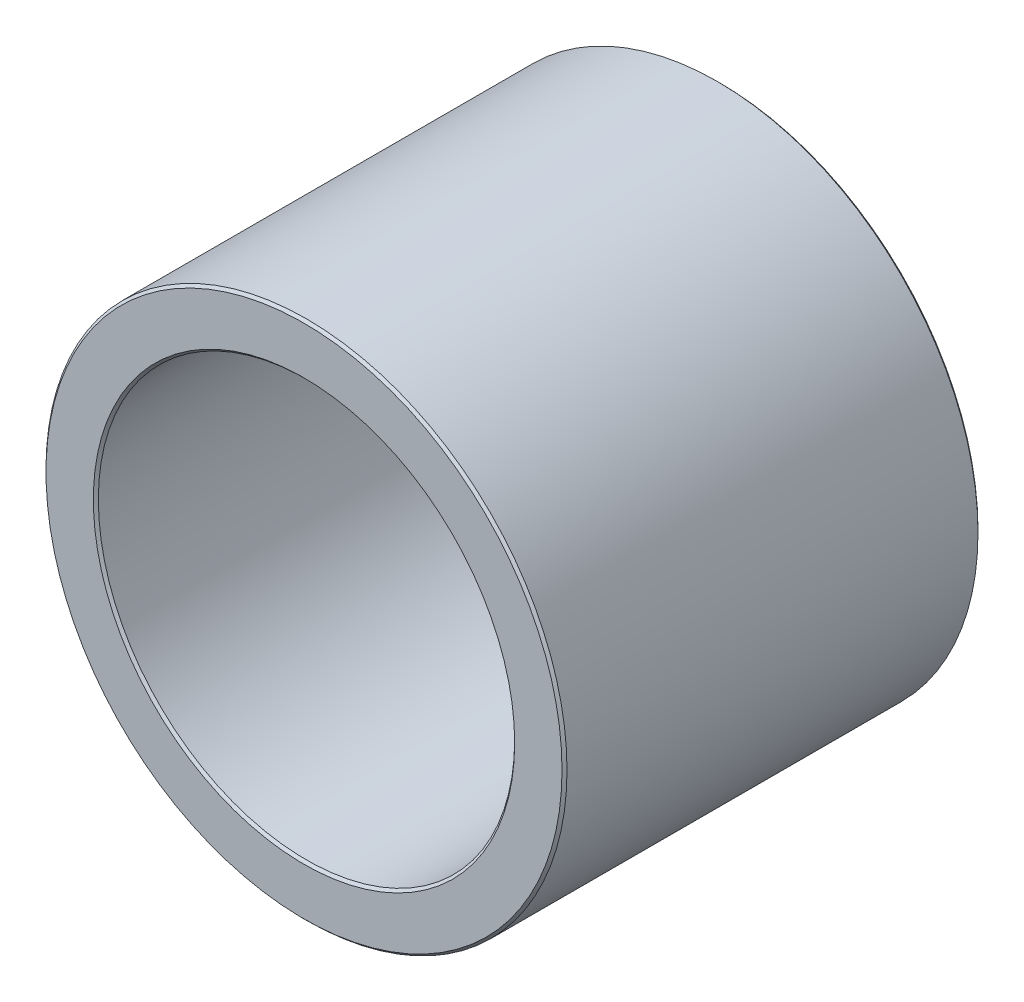
ISO-10303-21;
HEADER;
FILE_DESCRIPTION(('STEP AP214'),'2;1');
FILE_NAME('part.step','',(''),(''),'','','');
FILE_SCHEMA(('AUTOMOTIVE_DESIGN { 1 0 10303 214 1 1 1 1 }'));
ENDSEC;
DATA;
#1=APPLICATION_CONTEXT('core data for automotive mechanical design processes');
#2=APPLICATION_PROTOCOL_DEFINITION('international standard','automotive_design',2000,#1);
#3=PRODUCT_CONTEXT('',#1,'mechanical');
#4=PRODUCT('Part','Part','',(#3));
#5=PRODUCT_RELATED_PRODUCT_CATEGORY('part','',(#4));
#6=PRODUCT_DEFINITION_FORMATION('','',#4);
#7=PRODUCT_DEFINITION_CONTEXT('part definition',#1,'design');
#8=PRODUCT_DEFINITION('design','',#6,#7);
#9=PRODUCT_DEFINITION_SHAPE('','',#8);
#10=(LENGTH_UNIT() NAMED_UNIT(*) SI_UNIT(.MILLI.,.METRE.));
#11=(NAMED_UNIT(*) PLANE_ANGLE_UNIT() SI_UNIT($,.RADIAN.));
#12=(NAMED_UNIT(*) SI_UNIT($,.STERADIAN.) SOLID_ANGLE_UNIT());
#13=UNCERTAINTY_MEASURE_WITH_UNIT(LENGTH_MEASURE(1.E-05),#10,'distance_accuracy_value','');
#14=(GEOMETRIC_REPRESENTATION_CONTEXT(3) GLOBAL_UNCERTAINTY_ASSIGNED_CONTEXT((#13)) GLOBAL_UNIT_ASSIGNED_CONTEXT((#10,
#11,#12)) REPRESENTATION_CONTEXT('',''));
#15=CARTESIAN_POINT('',(0.,0.,0.));
#16=DIRECTION('',(0.,0.,1.));
#17=DIRECTION('',(1.,0.,0.));
#18=AXIS2_PLACEMENT_3D('',#15,#16,#17);
#19=CARTESIAN_POINT('',(0.,0.,6.));
#20=DIRECTION('',(0.,0.,1.));
#21=DIRECTION('',(1.,0.,0.));
#22=AXIS2_PLACEMENT_3D('',#19,#20,#21);
#23=PLANE('',#22);
#24=CARTESIAN_POINT('',(0.,0.,6.));
#25=DIRECTION('',(0.,0.,1.));
#26=DIRECTION('',(1.,0.,0.));
#27=AXIS2_PLACEMENT_3D('',#24,#25,#26);
#28=CIRCLE('',#27,6.07706000000001);
#29=CARTESIAN_POINT('',(6.07706000000001,0.,6.));
#30=VERTEX_POINT('',#29);
#31=EDGE_CURVE('E10',#30,#30,#28,.F.);
#32=ORIENTED_EDGE('',*,*,#31,.T.);
#33=EDGE_LOOP('',(#32));
#34=FACE_BOUND('',#33,.T.);
#35=CARTESIAN_POINT('',(0.,0.,6.));
#36=DIRECTION('',(0.,0.,1.));
#37=DIRECTION('',(1.,0.,0.));
#38=AXIS2_PLACEMENT_3D('',#35,#36,#37);
#39=CIRCLE('',#38,7.44294);
#40=CARTESIAN_POINT('',(7.44294,0.,6.));
#41=VERTEX_POINT('',#40);
#42=EDGE_CURVE('E39',#41,#41,#39,.T.);
#43=ORIENTED_EDGE('',*,*,#42,.T.);
#44=EDGE_LOOP('',(#43));
#45=FACE_BOUND('',#44,.T.);
#46=ADVANCED_FACE('F32',(#34,#45),#23,.T.);
#47=CARTESIAN_POINT('',(0.,0.,6.));
#48=DIRECTION('',(0.,0.,-1.));
#49=DIRECTION('',(-1.,0.,0.));
#50=AXIS2_PLACEMENT_3D('',#47,#48,#49);
#51=CYLINDRICAL_SURFACE('',#50,7.515);
#52=CARTESIAN_POINT('',(0.,0.,-5.92793999999999));
#53=DIRECTION('',(0.,0.,1.));
#54=DIRECTION('',(1.,0.,0.));
#55=AXIS2_PLACEMENT_3D('',#52,#53,#54);
#56=CIRCLE('',#55,7.515);
#57=CARTESIAN_POINT('',(7.515,0.,-5.92793999999999));
#58=VERTEX_POINT('',#57);
#59=EDGE_CURVE('E58',#58,#58,#56,.T.);
#60=ORIENTED_EDGE('',*,*,#59,.T.);
#61=EDGE_LOOP('',(#60));
#62=FACE_BOUND('',#61,.T.);
#63=CARTESIAN_POINT('',(0.,0.,5.92793999999999));
#64=DIRECTION('',(0.,0.,1.));
#65=DIRECTION('',(1.,0.,0.));
#66=AXIS2_PLACEMENT_3D('',#63,#64,#65);
#67=CIRCLE('',#66,7.515);
#68=CARTESIAN_POINT('',(7.515,0.,5.92793999999999));
#69=VERTEX_POINT('',#68);
#70=EDGE_CURVE('E61',#69,#69,#67,.F.);
#71=ORIENTED_EDGE('',*,*,#70,.T.);
#72=EDGE_LOOP('',(#71));
#73=FACE_BOUND('',#72,.T.);
#74=ADVANCED_FACE('F65',(#62,#73),#51,.T.);
#75=CARTESIAN_POINT('',(0.,0.,6.));
#76=DIRECTION('',(0.,0.,-1.));
#77=DIRECTION('',(-1.,0.,0.));
#78=AXIS2_PLACEMENT_3D('',#75,#76,#77);
#79=CYLINDRICAL_SURFACE('',#78,6.005);
#80=CARTESIAN_POINT('',(0.,0.,-5.92793999999999));
#81=DIRECTION('',(0.,0.,1.));
#82=DIRECTION('',(1.,0.,0.));
#83=AXIS2_PLACEMENT_3D('',#80,#81,#82);
#84=CIRCLE('',#83,6.005);
#85=CARTESIAN_POINT('',(6.005,0.,-5.92793999999999));
#86=VERTEX_POINT('',#85);
#87=EDGE_CURVE('E43',#86,#86,#84,.F.);
#88=ORIENTED_EDGE('',*,*,#87,.T.);
#89=EDGE_LOOP('',(#88));
#90=FACE_BOUND('',#89,.T.);
#91=CARTESIAN_POINT('',(0.,0.,5.92793999999999));
#92=DIRECTION('',(0.,0.,1.));
#93=DIRECTION('',(1.,0.,0.));
#94=AXIS2_PLACEMENT_3D('',#91,#92,#93);
#95=CIRCLE('',#94,6.005);
#96=CARTESIAN_POINT('',(6.005,0.,5.92793999999999));
#97=VERTEX_POINT('',#96);
#98=EDGE_CURVE('E47',#97,#97,#95,.T.);
#99=ORIENTED_EDGE('',*,*,#98,.T.);
#100=EDGE_LOOP('',(#99));
#101=FACE_BOUND('',#100,.T.);
#102=ADVANCED_FACE('F80',(#90,#101),#79,.F.);
#103=CARTESIAN_POINT('',(0.,0.,-6.));
#104=DIRECTION('',(0.,0.,1.));
#105=DIRECTION('',(1.,0.,0.));
#106=AXIS2_PLACEMENT_3D('',#103,#104,#105);
#107=PLANE('',#106);
#108=CARTESIAN_POINT('',(0.,0.,-6.));
#109=DIRECTION('',(0.,0.,1.));
#110=DIRECTION('',(1.,0.,0.));
#111=AXIS2_PLACEMENT_3D('',#108,#109,#110);
#112=CIRCLE('',#111,7.44294);
#113=CARTESIAN_POINT('',(7.44294,0.,-6.));
#114=VERTEX_POINT('',#113);
#115=EDGE_CURVE('E52',#114,#114,#112,.F.);
#116=ORIENTED_EDGE('',*,*,#115,.T.);
#117=EDGE_LOOP('',(#116));
#118=FACE_BOUND('',#117,.T.);
#119=CARTESIAN_POINT('',(0.,0.,-6.));
#120=DIRECTION('',(0.,0.,1.));
#121=DIRECTION('',(1.,0.,0.));
#122=AXIS2_PLACEMENT_3D('',#119,#120,#121);
#123=CIRCLE('',#122,6.07706000000001);
#124=CARTESIAN_POINT('',(6.07706000000001,0.,-6.));
#125=VERTEX_POINT('',#124);
#126=EDGE_CURVE('E55',#125,#125,#123,.T.);
#127=ORIENTED_EDGE('',*,*,#126,.T.);
#128=EDGE_LOOP('',(#127));
#129=FACE_BOUND('',#128,.T.);
#130=ADVANCED_FACE('F89',(#118,#129),#107,.F.);
#131=CARTESIAN_POINT('',(0.,0.,-5.92793999999999));
#132=DIRECTION('',(0.,0.,1.));
#133=DIRECTION('',(1.,0.,0.));
#134=AXIS2_PLACEMENT_3D('',#131,#132,#133);
#135=CONICAL_SURFACE('',#134,7.515,0.785398163397436);
#136=ORIENTED_EDGE('',*,*,#115,.F.);
#137=EDGE_LOOP('',(#136));
#138=FACE_BOUND('',#137,.T.);
#139=ORIENTED_EDGE('',*,*,#59,.F.);
#140=EDGE_LOOP('',(#139));
#141=FACE_BOUND('',#140,.T.);
#142=ADVANCED_FACE('F86',(#138,#141),#135,.T.);
#143=CARTESIAN_POINT('',(0.,0.,-6.));
#144=DIRECTION('',(0.,0.,-1.));
#145=DIRECTION('',(-1.,0.,0.));
#146=AXIS2_PLACEMENT_3D('',#143,#144,#145);
#147=CONICAL_SURFACE('',#146,6.07706000000001,0.785398163397454);
#148=ORIENTED_EDGE('',*,*,#87,.F.);
#149=EDGE_LOOP('',(#148));
#150=FACE_BOUND('',#149,.T.);
#151=ORIENTED_EDGE('',*,*,#126,.F.);
#152=EDGE_LOOP('',(#151));
#153=FACE_BOUND('',#152,.T.);
#154=ADVANCED_FACE('F73',(#150,#153),#147,.F.);
#155=CARTESIAN_POINT('',(0.,0.,5.92793999999999));
#156=DIRECTION('',(0.,0.,1.));
#157=DIRECTION('',(1.,0.,0.));
#158=AXIS2_PLACEMENT_3D('',#155,#156,#157);
#159=CONICAL_SURFACE('',#158,6.005,0.785398163397448);
#160=ORIENTED_EDGE('',*,*,#31,.F.);
#161=EDGE_LOOP('',(#160));
#162=FACE_BOUND('',#161,.T.);
#163=ORIENTED_EDGE('',*,*,#98,.F.);
#164=EDGE_LOOP('',(#163));
#165=FACE_BOUND('',#164,.T.);
#166=ADVANCED_FACE('F69',(#162,#165),#159,.F.);
#167=CARTESIAN_POINT('',(0.,0.,6.));
#168=DIRECTION('',(0.,0.,-1.));
#169=DIRECTION('',(-1.,0.,0.));
#170=AXIS2_PLACEMENT_3D('',#167,#168,#169);
#171=CONICAL_SURFACE('',#170,7.44294,0.785398163397424);
#172=ORIENTED_EDGE('',*,*,#70,.F.);
#173=EDGE_LOOP('',(#172));
#174=FACE_BOUND('',#173,.T.);
#175=ORIENTED_EDGE('',*,*,#42,.F.);
#176=EDGE_LOOP('',(#175));
#177=FACE_BOUND('',#176,.T.);
#178=ADVANCED_FACE('F34',(#174,#177),#171,.T.);
#179=CLOSED_SHELL('',(#46,#74,#102,#130,#142,#154,#166,#178));
#180=MANIFOLD_SOLID_BREP('B2',#179);
#181=ADVANCED_BREP_SHAPE_REPRESENTATION('',(#18,#180),#14);
#182=SHAPE_DEFINITION_REPRESENTATION(#9,#181);
ENDSEC;
END-ISO-10303-21;
